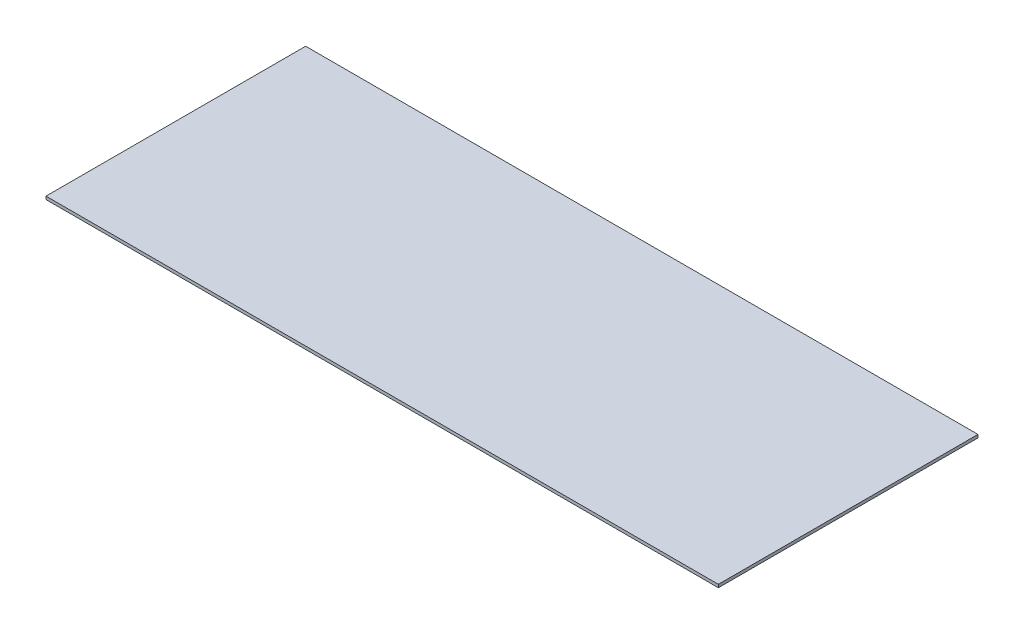
ISO-10303-21;
HEADER;
FILE_DESCRIPTION(('STEP AP214'),'2;1');
FILE_NAME('part.step','',(''),(''),'','','');
FILE_SCHEMA(('AUTOMOTIVE_DESIGN { 1 0 10303 214 1 1 1 1 }'));
ENDSEC;
DATA;
#1=APPLICATION_CONTEXT('core data for automotive mechanical design processes');
#2=APPLICATION_PROTOCOL_DEFINITION('international standard','automotive_design',2000,#1);
#3=PRODUCT_CONTEXT('',#1,'mechanical');
#4=PRODUCT('Part','Part','',(#3));
#5=PRODUCT_RELATED_PRODUCT_CATEGORY('part','',(#4));
#6=PRODUCT_DEFINITION_FORMATION('','',#4);
#7=PRODUCT_DEFINITION_CONTEXT('part definition',#1,'design');
#8=PRODUCT_DEFINITION('design','',#6,#7);
#9=PRODUCT_DEFINITION_SHAPE('','',#8);
#10=(LENGTH_UNIT() NAMED_UNIT(*) SI_UNIT(.MILLI.,.METRE.));
#11=(NAMED_UNIT(*) PLANE_ANGLE_UNIT() SI_UNIT($,.RADIAN.));
#12=(NAMED_UNIT(*) SI_UNIT($,.STERADIAN.) SOLID_ANGLE_UNIT());
#13=UNCERTAINTY_MEASURE_WITH_UNIT(LENGTH_MEASURE(1.E-05),#10,'distance_accuracy_value','');
#14=(GEOMETRIC_REPRESENTATION_CONTEXT(3) GLOBAL_UNCERTAINTY_ASSIGNED_CONTEXT((#13)) GLOBAL_UNIT_ASSIGNED_CONTEXT((#10,
#11,#12)) REPRESENTATION_CONTEXT('',''));
#15=CARTESIAN_POINT('',(0.,0.,0.));
#16=DIRECTION('',(0.,0.,1.));
#17=DIRECTION('',(1.,0.,0.));
#18=AXIS2_PLACEMENT_3D('',#15,#16,#17);
#19=CARTESIAN_POINT('',(0.,2.,0.));
#20=DIRECTION('',(1.,0.,0.));
#21=DIRECTION('',(0.,0.,-1.));
#22=AXIS2_PLACEMENT_3D('',#19,#20,#21);
#23=PLANE('',#22);
#24=DIRECTION('',(0.,0.,1.));
#25=VECTOR('',#24,1.);
#26=CARTESIAN_POINT('',(0.,0.,0.));
#27=LINE('',#26,#25);
#28=CARTESIAN_POINT('',(0.,0.,-173.));
#29=VERTEX_POINT('',#28);
#30=CARTESIAN_POINT('',(0.,0.,0.));
#31=VERTEX_POINT('',#30);
#32=EDGE_CURVE('E107',#29,#31,#27,.T.);
#33=ORIENTED_EDGE('',*,*,#32,.T.);
#34=DIRECTION('',(0.,-1.,0.));
#35=VECTOR('',#34,1.);
#36=CARTESIAN_POINT('',(0.,2.,0.));
#37=LINE('',#36,#35);
#38=CARTESIAN_POINT('',(0.,2.,0.));
#39=VERTEX_POINT('',#38);
#40=EDGE_CURVE('E11',#39,#31,#37,.T.);
#41=ORIENTED_EDGE('',*,*,#40,.F.);
#42=DIRECTION('',(0.,0.,1.));
#43=VECTOR('',#42,1.);
#44=CARTESIAN_POINT('',(0.,2.,0.));
#45=LINE('',#44,#43);
#46=CARTESIAN_POINT('',(0.,2.,-173.));
#47=VERTEX_POINT('',#46);
#48=EDGE_CURVE('E91',#47,#39,#45,.T.);
#49=ORIENTED_EDGE('',*,*,#48,.F.);
#50=DIRECTION('',(0.,-1.,0.));
#51=VECTOR('',#50,1.);
#52=CARTESIAN_POINT('',(0.,2.,-173.));
#53=LINE('',#52,#51);
#54=EDGE_CURVE('E103',#47,#29,#53,.T.);
#55=ORIENTED_EDGE('',*,*,#54,.T.);
#56=EDGE_LOOP('',(#33,#41,#49,#55));
#57=FACE_BOUND('',#56,.T.);
#58=ADVANCED_FACE('F39',(#57),#23,.F.);
#59=CARTESIAN_POINT('',(0.,2.,0.));
#60=DIRECTION('',(0.,0.,-1.));
#61=DIRECTION('',(-1.,0.,0.));
#62=AXIS2_PLACEMENT_3D('',#59,#60,#61);
#63=PLANE('',#62);
#64=DIRECTION('',(1.,0.,0.));
#65=VECTOR('',#64,1.);
#66=CARTESIAN_POINT('',(0.,0.,0.));
#67=LINE('',#66,#65);
#68=CARTESIAN_POINT('',(448.,0.,0.));
#69=VERTEX_POINT('',#68);
#70=EDGE_CURVE('E96',#31,#69,#67,.T.);
#71=ORIENTED_EDGE('',*,*,#70,.T.);
#72=DIRECTION('',(0.,-1.,0.));
#73=VECTOR('',#72,1.);
#74=CARTESIAN_POINT('',(448.,2.,0.));
#75=LINE('',#74,#73);
#76=CARTESIAN_POINT('',(448.,2.,0.));
#77=VERTEX_POINT('',#76);
#78=EDGE_CURVE('E48',#77,#69,#75,.T.);
#79=ORIENTED_EDGE('',*,*,#78,.F.);
#80=DIRECTION('',(1.,0.,0.));
#81=VECTOR('',#80,1.);
#82=CARTESIAN_POINT('',(0.,2.,0.));
#83=LINE('',#82,#81);
#84=EDGE_CURVE('E86',#39,#77,#83,.T.);
#85=ORIENTED_EDGE('',*,*,#84,.F.);
#86=ORIENTED_EDGE('',*,*,#40,.T.);
#87=EDGE_LOOP('',(#71,#79,#85,#86));
#88=FACE_BOUND('',#87,.T.);
#89=ADVANCED_FACE('F95',(#88),#63,.F.);
#90=CARTESIAN_POINT('',(448.,2.,0.));
#91=DIRECTION('',(-1.,0.,0.));
#92=DIRECTION('',(0.,0.,1.));
#93=AXIS2_PLACEMENT_3D('',#90,#91,#92);
#94=PLANE('',#93);
#95=DIRECTION('',(0.,0.,-1.));
#96=VECTOR('',#95,1.);
#97=CARTESIAN_POINT('',(448.,0.,0.));
#98=LINE('',#97,#96);
#99=CARTESIAN_POINT('',(448.,0.,-173.));
#100=VERTEX_POINT('',#99);
#101=EDGE_CURVE('E73',#69,#100,#98,.T.);
#102=ORIENTED_EDGE('',*,*,#101,.T.);
#103=DIRECTION('',(0.,-1.,0.));
#104=VECTOR('',#103,1.);
#105=CARTESIAN_POINT('',(448.,2.,-173.));
#106=LINE('',#105,#104);
#107=CARTESIAN_POINT('',(448.,2.,-173.));
#108=VERTEX_POINT('',#107);
#109=EDGE_CURVE('E98',#108,#100,#106,.T.);
#110=ORIENTED_EDGE('',*,*,#109,.F.);
#111=DIRECTION('',(0.,0.,-1.));
#112=VECTOR('',#111,1.);
#113=CARTESIAN_POINT('',(448.,2.,0.));
#114=LINE('',#113,#112);
#115=EDGE_CURVE('E89',#77,#108,#114,.T.);
#116=ORIENTED_EDGE('',*,*,#115,.F.);
#117=ORIENTED_EDGE('',*,*,#78,.T.);
#118=EDGE_LOOP('',(#102,#110,#116,#117));
#119=FACE_BOUND('',#118,.T.);
#120=ADVANCED_FACE('F99',(#119),#94,.F.);
#121=CARTESIAN_POINT('',(0.,2.,-173.));
#122=DIRECTION('',(0.,0.,1.));
#123=DIRECTION('',(1.,0.,0.));
#124=AXIS2_PLACEMENT_3D('',#121,#122,#123);
#125=PLANE('',#124);
#126=DIRECTION('',(-1.,0.,0.));
#127=VECTOR('',#126,1.);
#128=CARTESIAN_POINT('',(0.,0.,-173.));
#129=LINE('',#128,#127);
#130=EDGE_CURVE('E79',#100,#29,#129,.T.);
#131=ORIENTED_EDGE('',*,*,#130,.T.);
#132=ORIENTED_EDGE('',*,*,#54,.F.);
#133=DIRECTION('',(-1.,0.,0.));
#134=VECTOR('',#133,1.);
#135=CARTESIAN_POINT('',(0.,2.,-173.));
#136=LINE('',#135,#134);
#137=EDGE_CURVE('E56',#108,#47,#136,.T.);
#138=ORIENTED_EDGE('',*,*,#137,.F.);
#139=ORIENTED_EDGE('',*,*,#109,.T.);
#140=EDGE_LOOP('',(#131,#132,#138,#139));
#141=FACE_BOUND('',#140,.T.);
#142=ADVANCED_FACE('F120',(#141),#125,.F.);
#143=CARTESIAN_POINT('',(0.,2.,0.));
#144=DIRECTION('',(0.,-1.,0.));
#145=DIRECTION('',(0.,0.,-1.));
#146=AXIS2_PLACEMENT_3D('',#143,#144,#145);
#147=PLANE('',#146);
#148=ORIENTED_EDGE('',*,*,#48,.T.);
#149=ORIENTED_EDGE('',*,*,#84,.T.);
#150=ORIENTED_EDGE('',*,*,#115,.T.);
#151=ORIENTED_EDGE('',*,*,#137,.T.);
#152=EDGE_LOOP('',(#148,#149,#150,#151));
#153=FACE_BOUND('',#152,.T.);
#154=ADVANCED_FACE('F87',(#153),#147,.F.);
#155=CARTESIAN_POINT('',(0.,0.,0.));
#156=DIRECTION('',(0.,-1.,0.));
#157=DIRECTION('',(0.,0.,-1.));
#158=AXIS2_PLACEMENT_3D('',#155,#156,#157);
#159=PLANE('',#158);
#160=ORIENTED_EDGE('',*,*,#32,.F.);
#161=ORIENTED_EDGE('',*,*,#130,.F.);
#162=ORIENTED_EDGE('',*,*,#101,.F.);
#163=ORIENTED_EDGE('',*,*,#70,.F.);
#164=EDGE_LOOP('',(#160,#161,#162,#163));
#165=FACE_BOUND('',#164,.T.);
#166=ADVANCED_FACE('F123',(#165),#159,.T.);
#167=CLOSED_SHELL('',(#58,#89,#120,#142,#154,#166));
#168=MANIFOLD_SOLID_BREP('B2',#167);
#169=ADVANCED_BREP_SHAPE_REPRESENTATION('',(#18,#168),#14);
#170=SHAPE_DEFINITION_REPRESENTATION(#9,#169);
ENDSEC;
END-ISO-10303-21;
